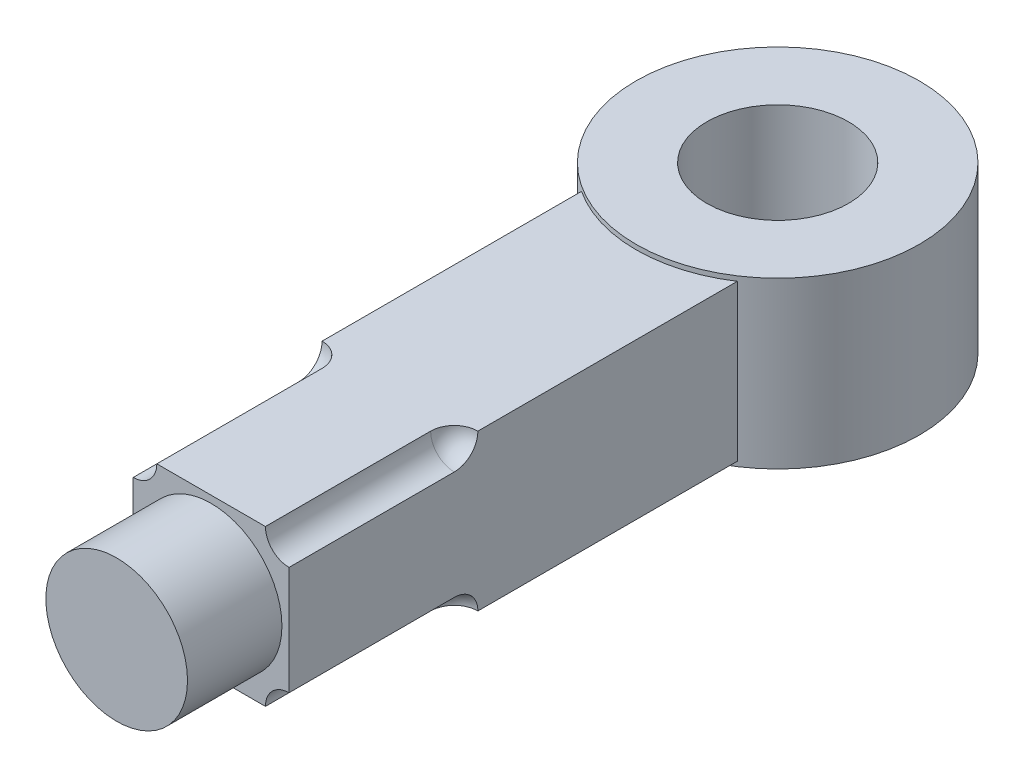
ISO-10303-21;
HEADER;
FILE_DESCRIPTION(('STEP AP214'),'2;1');
FILE_NAME('part.step','',(''),(''),'','','');
FILE_SCHEMA(('AUTOMOTIVE_DESIGN { 1 0 10303 214 1 1 1 1 }'));
ENDSEC;
DATA;
#1=APPLICATION_CONTEXT('core data for automotive mechanical design processes');
#2=APPLICATION_PROTOCOL_DEFINITION('international standard','automotive_design',2000,#1);
#3=PRODUCT_CONTEXT('',#1,'mechanical');
#4=PRODUCT('Part','Part','',(#3));
#5=PRODUCT_RELATED_PRODUCT_CATEGORY('part','',(#4));
#6=PRODUCT_DEFINITION_FORMATION('','',#4);
#7=PRODUCT_DEFINITION_CONTEXT('part definition',#1,'design');
#8=PRODUCT_DEFINITION('design','',#6,#7);
#9=PRODUCT_DEFINITION_SHAPE('','',#8);
#10=(LENGTH_UNIT() NAMED_UNIT(*) SI_UNIT(.MILLI.,.METRE.));
#11=(NAMED_UNIT(*) PLANE_ANGLE_UNIT() SI_UNIT($,.RADIAN.));
#12=(NAMED_UNIT(*) SI_UNIT($,.STERADIAN.) SOLID_ANGLE_UNIT());
#13=UNCERTAINTY_MEASURE_WITH_UNIT(LENGTH_MEASURE(1.E-05),#10,'distance_accuracy_value','');
#14=(GEOMETRIC_REPRESENTATION_CONTEXT(3) GLOBAL_UNCERTAINTY_ASSIGNED_CONTEXT((#13)) GLOBAL_UNIT_ASSIGNED_CONTEXT((#10,
#11,#12)) REPRESENTATION_CONTEXT('',''));
#15=CARTESIAN_POINT('',(0.,0.,0.));
#16=DIRECTION('',(0.,0.,1.));
#17=DIRECTION('',(1.,0.,0.));
#18=AXIS2_PLACEMENT_3D('',#15,#16,#17);
#19=CARTESIAN_POINT('',(-16.5,16.5,120.));
#20=DIRECTION('',(1.,0.,0.));
#21=DIRECTION('',(0.,1.,0.));
#22=AXIS2_PLACEMENT_3D('',#19,#20,#21);
#23=PLANE('',#22);
#24=DIRECTION('',(0.,0.,1.));
#25=VECTOR('',#24,1.);
#26=CARTESIAN_POINT('',(-16.5,11.4999999999999,80.));
#27=LINE('',#26,#25);
#28=CARTESIAN_POINT('',(-16.5,11.4999999999999,85.));
#29=VERTEX_POINT('',#28);
#30=CARTESIAN_POINT('',(-16.5,11.4999999999999,120.));
#31=VERTEX_POINT('',#30);
#32=EDGE_CURVE('E134',#29,#31,#27,.T.);
#33=ORIENTED_EDGE('',*,*,#32,.F.);
#34=CARTESIAN_POINT('',(-16.5,16.4999999999999,85.));
#35=DIRECTION('',(1.,0.,0.));
#36=DIRECTION('',(0.,1.,0.));
#37=AXIS2_PLACEMENT_3D('',#34,#35,#36);
#38=CIRCLE('',#37,5.);
#39=CARTESIAN_POINT('',(-16.5000000000001,16.4999999999999,80.));
#40=VERTEX_POINT('',#39);
#41=EDGE_CURVE('E121',#29,#40,#38,.T.);
#42=ORIENTED_EDGE('',*,*,#41,.T.);
#43=DIRECTION('',(0.,0.,-1.));
#44=VECTOR('',#43,1.);
#45=CARTESIAN_POINT('',(-16.5,16.5,120.));
#46=LINE('',#45,#44);
#47=CARTESIAN_POINT('',(-16.5,16.5,25.0549396327351));
#48=VERTEX_POINT('',#47);
#49=EDGE_CURVE('E126',#40,#48,#46,.T.);
#50=ORIENTED_EDGE('',*,*,#49,.T.);
#51=DIRECTION('',(0.,-1.,0.));
#52=VECTOR('',#51,1.);
#53=CARTESIAN_POINT('',(-16.5,17.5,25.0549396327351));
#54=LINE('',#53,#52);
#55=CARTESIAN_POINT('',(-16.5,-16.5,25.0549396327351));
#56=VERTEX_POINT('',#55);
#57=EDGE_CURVE('E205',#48,#56,#54,.T.);
#58=ORIENTED_EDGE('',*,*,#57,.T.);
#59=DIRECTION('',(0.,0.,-1.));
#60=VECTOR('',#59,1.);
#61=CARTESIAN_POINT('',(-16.5,-16.5,120.));
#62=LINE('',#61,#60);
#63=CARTESIAN_POINT('',(-16.5,-16.5,80.));
#64=VERTEX_POINT('',#63);
#65=EDGE_CURVE('E212',#64,#56,#62,.T.);
#66=ORIENTED_EDGE('',*,*,#65,.F.);
#67=CARTESIAN_POINT('',(-16.5,-16.5,85.));
#68=DIRECTION('',(1.,0.,0.));
#69=DIRECTION('',(0.,1.,0.));
#70=AXIS2_PLACEMENT_3D('',#67,#68,#69);
#71=CIRCLE('',#70,5.);
#72=CARTESIAN_POINT('',(-16.5,-11.5,85.));
#73=VERTEX_POINT('',#72);
#74=EDGE_CURVE('E160',#64,#73,#71,.T.);
#75=ORIENTED_EDGE('',*,*,#74,.T.);
#76=DIRECTION('',(0.,0.,1.));
#77=VECTOR('',#76,1.);
#78=CARTESIAN_POINT('',(-16.5,-11.5,80.));
#79=LINE('',#78,#77);
#80=CARTESIAN_POINT('',(-16.5,-11.5,120.));
#81=VERTEX_POINT('',#80);
#82=EDGE_CURVE('E251',#73,#81,#79,.T.);
#83=ORIENTED_EDGE('',*,*,#82,.T.);
#84=DIRECTION('',(0.,-1.,0.));
#85=VECTOR('',#84,1.);
#86=CARTESIAN_POINT('',(-16.5,16.5,120.));
#87=LINE('',#86,#85);
#88=EDGE_CURVE('E197',#31,#81,#87,.T.);
#89=ORIENTED_EDGE('',*,*,#88,.F.);
#90=EDGE_LOOP('',(#33,#42,#50,#58,#66,#75,#83,#89));
#91=FACE_BOUND('',#90,.T.);
#92=ADVANCED_FACE('F39',(#91),#23,.F.);
#93=CARTESIAN_POINT('',(16.5,16.5,120.));
#94=DIRECTION('',(-1.,0.,0.));
#95=DIRECTION('',(0.,0.,1.));
#96=AXIS2_PLACEMENT_3D('',#93,#94,#95);
#97=PLANE('',#96);
#98=DIRECTION('',(0.,0.,1.));
#99=VECTOR('',#98,1.);
#100=CARTESIAN_POINT('',(16.5000000000001,-11.4999999999998,80.));
#101=LINE('',#100,#99);
#102=CARTESIAN_POINT('',(16.5000000000001,-11.4999999999998,85.));
#103=VERTEX_POINT('',#102);
#104=CARTESIAN_POINT('',(16.5000000000001,-11.4999999999998,120.));
#105=VERTEX_POINT('',#104);
#106=EDGE_CURVE('E167',#103,#105,#101,.T.);
#107=ORIENTED_EDGE('',*,*,#106,.F.);
#108=CARTESIAN_POINT('',(16.5,-16.4999999999998,85.));
#109=DIRECTION('',(-1.,0.,0.));
#110=DIRECTION('',(0.,0.,1.));
#111=AXIS2_PLACEMENT_3D('',#108,#109,#110);
#112=CIRCLE('',#111,5.);
#113=CARTESIAN_POINT('',(16.5000000000002,-16.4999999999998,80.));
#114=VERTEX_POINT('',#113);
#115=EDGE_CURVE('E11',#103,#114,#112,.T.);
#116=ORIENTED_EDGE('',*,*,#115,.T.);
#117=DIRECTION('',(0.,0.,-1.));
#118=VECTOR('',#117,1.);
#119=CARTESIAN_POINT('',(16.5,-16.5,120.));
#120=LINE('',#119,#118);
#121=CARTESIAN_POINT('',(16.5,-16.5,25.0549396327351));
#122=VERTEX_POINT('',#121);
#123=EDGE_CURVE('E215',#114,#122,#120,.T.);
#124=ORIENTED_EDGE('',*,*,#123,.T.);
#125=DIRECTION('',(0.,-1.,0.));
#126=VECTOR('',#125,1.);
#127=CARTESIAN_POINT('',(16.5,17.5,25.0549396327351));
#128=LINE('',#127,#126);
#129=CARTESIAN_POINT('',(16.5,16.5,25.0549396327351));
#130=VERTEX_POINT('',#129);
#131=EDGE_CURVE('E224',#122,#130,#128,.F.);
#132=ORIENTED_EDGE('',*,*,#131,.T.);
#133=DIRECTION('',(0.,0.,-1.));
#134=VECTOR('',#133,1.);
#135=CARTESIAN_POINT('',(16.5,16.5,120.));
#136=LINE('',#135,#134);
#137=CARTESIAN_POINT('',(16.5,16.5,80.));
#138=VERTEX_POINT('',#137);
#139=EDGE_CURVE('E144',#138,#130,#136,.T.);
#140=ORIENTED_EDGE('',*,*,#139,.F.);
#141=CARTESIAN_POINT('',(16.5,16.5,85.));
#142=DIRECTION('',(-1.,0.,0.));
#143=DIRECTION('',(0.,0.,1.));
#144=AXIS2_PLACEMENT_3D('',#141,#142,#143);
#145=CIRCLE('',#144,5.);
#146=CARTESIAN_POINT('',(16.5,11.5,85.));
#147=VERTEX_POINT('',#146);
#148=EDGE_CURVE('E235',#138,#147,#145,.T.);
#149=ORIENTED_EDGE('',*,*,#148,.T.);
#150=DIRECTION('',(0.,0.,1.));
#151=VECTOR('',#150,1.);
#152=CARTESIAN_POINT('',(16.5,11.5,80.));
#153=LINE('',#152,#151);
#154=CARTESIAN_POINT('',(16.5,11.5,120.));
#155=VERTEX_POINT('',#154);
#156=EDGE_CURVE('E183',#147,#155,#153,.T.);
#157=ORIENTED_EDGE('',*,*,#156,.T.);
#158=DIRECTION('',(0.,1.,0.));
#159=VECTOR('',#158,1.);
#160=CARTESIAN_POINT('',(16.5,16.5,120.));
#161=LINE('',#160,#159);
#162=EDGE_CURVE('E175',#105,#155,#161,.T.);
#163=ORIENTED_EDGE('',*,*,#162,.F.);
#164=EDGE_LOOP('',(#107,#116,#124,#132,#140,#149,#157,#163));
#165=FACE_BOUND('',#164,.T.);
#166=ADVANCED_FACE('F174',(#165),#97,.F.);
#167=CARTESIAN_POINT('',(16.5,-16.5,120.));
#168=DIRECTION('',(0.,1.,0.));
#169=DIRECTION('',(-1.,0.,0.));
#170=AXIS2_PLACEMENT_3D('',#167,#168,#169);
#171=PLANE('',#170);
#172=DIRECTION('',(0.,0.,1.));
#173=VECTOR('',#172,1.);
#174=CARTESIAN_POINT('',(-11.5,-16.5,80.));
#175=LINE('',#174,#173);
#176=CARTESIAN_POINT('',(-11.5,-16.5,85.));
#177=VERTEX_POINT('',#176);
#178=CARTESIAN_POINT('',(-11.5,-16.5,120.));
#179=VERTEX_POINT('',#178);
#180=EDGE_CURVE('E258',#177,#179,#175,.T.);
#181=ORIENTED_EDGE('',*,*,#180,.F.);
#182=CARTESIAN_POINT('',(-16.5,-16.5,85.));
#183=DIRECTION('',(0.,1.,0.));
#184=DIRECTION('',(-1.,0.,0.));
#185=AXIS2_PLACEMENT_3D('',#182,#183,#184);
#186=CIRCLE('',#185,5.);
#187=EDGE_CURVE('E157',#177,#64,#186,.T.);
#188=ORIENTED_EDGE('',*,*,#187,.T.);
#189=ORIENTED_EDGE('',*,*,#65,.T.);
#190=CARTESIAN_POINT('',(0.,-16.5,0.));
#191=DIRECTION('',(0.,1.,0.));
#192=DIRECTION('',(-1.,0.,0.));
#193=AXIS2_PLACEMENT_3D('',#190,#191,#192);
#194=CIRCLE('',#193,30.);
#195=EDGE_CURVE('E229',#56,#122,#194,.T.);
#196=ORIENTED_EDGE('',*,*,#195,.T.);
#197=ORIENTED_EDGE('',*,*,#123,.F.);
#198=CARTESIAN_POINT('',(16.5000000000002,-16.5,85.));
#199=DIRECTION('',(0.,1.,0.));
#200=DIRECTION('',(-1.,0.,0.));
#201=AXIS2_PLACEMENT_3D('',#198,#199,#200);
#202=CIRCLE('',#201,5.);
#203=CARTESIAN_POINT('',(11.5000000000002,-16.4999999999999,85.));
#204=VERTEX_POINT('',#203);
#205=EDGE_CURVE('E50',#114,#204,#202,.T.);
#206=ORIENTED_EDGE('',*,*,#205,.T.);
#207=DIRECTION('',(0.,0.,1.));
#208=VECTOR('',#207,1.);
#209=CARTESIAN_POINT('',(11.5000000000002,-16.4999999999999,80.));
#210=LINE('',#209,#208);
#211=CARTESIAN_POINT('',(11.5000000000002,-16.4999999999999,120.));
#212=VERTEX_POINT('',#211);
#213=EDGE_CURVE('E169',#204,#212,#210,.T.);
#214=ORIENTED_EDGE('',*,*,#213,.T.);
#215=DIRECTION('',(1.,0.,0.));
#216=VECTOR('',#215,1.);
#217=CARTESIAN_POINT('',(16.5,-16.5,120.));
#218=LINE('',#217,#216);
#219=EDGE_CURVE('E202',#179,#212,#218,.T.);
#220=ORIENTED_EDGE('',*,*,#219,.F.);
#221=EDGE_LOOP('',(#181,#188,#189,#196,#197,#206,#214,#220));
#222=FACE_BOUND('',#221,.T.);
#223=ADVANCED_FACE('F268',(#222),#171,.F.);
#224=CARTESIAN_POINT('',(0.,0.,120.));
#225=DIRECTION('',(0.,0.,-1.));
#226=DIRECTION('',(-1.,0.,0.));
#227=AXIS2_PLACEMENT_3D('',#224,#225,#226);
#228=PLANE('',#227);
#229=CARTESIAN_POINT('',(0.,0.,120.));
#230=DIRECTION('',(0.,0.,1.));
#231=DIRECTION('',(1.,0.,0.));
#232=AXIS2_PLACEMENT_3D('',#229,#230,#231);
#233=CIRCLE('',#232,15.);
#234=CARTESIAN_POINT('',(15.,0.,120.));
#235=VERTEX_POINT('',#234);
#236=EDGE_CURVE('E196',#235,#235,#233,.T.);
#237=ORIENTED_EDGE('',*,*,#236,.F.);
#238=EDGE_LOOP('',(#237));
#239=FACE_BOUND('',#238,.T.);
#240=CARTESIAN_POINT('',(-16.5000000000001,16.4999999999999,120.));
#241=DIRECTION('',(0.,0.,1.));
#242=DIRECTION('',(0.,1.,0.));
#243=AXIS2_PLACEMENT_3D('',#240,#241,#242);
#244=CIRCLE('',#243,5.);
#245=CARTESIAN_POINT('',(-11.5000000000001,16.5,120.));
#246=VERTEX_POINT('',#245);
#247=EDGE_CURVE('E253',#31,#246,#244,.T.);
#248=ORIENTED_EDGE('',*,*,#247,.F.);
#249=ORIENTED_EDGE('',*,*,#88,.T.);
#250=CARTESIAN_POINT('',(-16.5,-16.5,120.));
#251=DIRECTION('',(0.,0.,1.));
#252=DIRECTION('',(-1.,0.,0.));
#253=AXIS2_PLACEMENT_3D('',#250,#251,#252);
#254=CIRCLE('',#253,5.);
#255=EDGE_CURVE('E177',#179,#81,#254,.T.);
#256=ORIENTED_EDGE('',*,*,#255,.F.);
#257=ORIENTED_EDGE('',*,*,#219,.T.);
#258=CARTESIAN_POINT('',(16.5000000000002,-16.4999999999998,120.));
#259=DIRECTION('',(0.,0.,1.));
#260=DIRECTION('',(0.,-1.,0.));
#261=AXIS2_PLACEMENT_3D('',#258,#259,#260);
#262=CIRCLE('',#261,5.);
#263=EDGE_CURVE('E173',#105,#212,#262,.T.);
#264=ORIENTED_EDGE('',*,*,#263,.F.);
#265=ORIENTED_EDGE('',*,*,#162,.T.);
#266=CARTESIAN_POINT('',(16.5,16.5,120.));
#267=DIRECTION('',(0.,0.,1.));
#268=DIRECTION('',(1.,0.,0.));
#269=AXIS2_PLACEMENT_3D('',#266,#267,#268);
#270=CIRCLE('',#269,5.);
#271=CARTESIAN_POINT('',(11.5,16.5,120.));
#272=VERTEX_POINT('',#271);
#273=EDGE_CURVE('E176',#272,#155,#270,.T.);
#274=ORIENTED_EDGE('',*,*,#273,.F.);
#275=DIRECTION('',(-1.,0.,0.));
#276=VECTOR('',#275,1.);
#277=CARTESIAN_POINT('',(16.5,16.5,120.));
#278=LINE('',#277,#276);
#279=EDGE_CURVE('E148',#272,#246,#278,.T.);
#280=ORIENTED_EDGE('',*,*,#279,.T.);
#281=EDGE_LOOP('',(#248,#249,#256,#257,#264,#265,#274,#280));
#282=FACE_BOUND('',#281,.T.);
#283=ADVANCED_FACE('F250',(#239,#282),#228,.F.);
#284=CARTESIAN_POINT('',(16.5,16.5,120.));
#285=DIRECTION('',(0.,-1.,0.));
#286=DIRECTION('',(1.,0.,0.));
#287=AXIS2_PLACEMENT_3D('',#284,#285,#286);
#288=PLANE('',#287);
#289=ORIENTED_EDGE('',*,*,#49,.F.);
#290=CARTESIAN_POINT('',(-16.5000000000001,16.5,85.));
#291=DIRECTION('',(0.,-1.,0.));
#292=DIRECTION('',(1.,0.,0.));
#293=AXIS2_PLACEMENT_3D('',#290,#291,#292);
#294=CIRCLE('',#293,5.);
#295=CARTESIAN_POINT('',(-11.5000000000001,16.5,85.));
#296=VERTEX_POINT('',#295);
#297=EDGE_CURVE('E140',#40,#296,#294,.T.);
#298=ORIENTED_EDGE('',*,*,#297,.T.);
#299=DIRECTION('',(0.,0.,1.));
#300=VECTOR('',#299,1.);
#301=CARTESIAN_POINT('',(-11.5000000000001,16.5,80.));
#302=LINE('',#301,#300);
#303=EDGE_CURVE('E184',#296,#246,#302,.T.);
#304=ORIENTED_EDGE('',*,*,#303,.T.);
#305=ORIENTED_EDGE('',*,*,#279,.F.);
#306=DIRECTION('',(0.,0.,1.));
#307=VECTOR('',#306,1.);
#308=CARTESIAN_POINT('',(11.5,16.5,80.));
#309=LINE('',#308,#307);
#310=CARTESIAN_POINT('',(11.5,16.5,85.));
#311=VERTEX_POINT('',#310);
#312=EDGE_CURVE('E181',#311,#272,#309,.T.);
#313=ORIENTED_EDGE('',*,*,#312,.F.);
#314=CARTESIAN_POINT('',(16.5,16.5,85.));
#315=DIRECTION('',(0.,-1.,0.));
#316=DIRECTION('',(1.,0.,0.));
#317=AXIS2_PLACEMENT_3D('',#314,#315,#316);
#318=CIRCLE('',#317,5.);
#319=EDGE_CURVE('E151',#311,#138,#318,.T.);
#320=ORIENTED_EDGE('',*,*,#319,.T.);
#321=ORIENTED_EDGE('',*,*,#139,.T.);
#322=CARTESIAN_POINT('',(0.,16.5,0.));
#323=DIRECTION('',(0.,-1.,0.));
#324=DIRECTION('',(1.,0.,0.));
#325=AXIS2_PLACEMENT_3D('',#322,#323,#324);
#326=CIRCLE('',#325,30.);
#327=EDGE_CURVE('E145',#130,#48,#326,.T.);
#328=ORIENTED_EDGE('',*,*,#327,.T.);
#329=EDGE_LOOP('',(#289,#298,#304,#305,#313,#320,#321,#328));
#330=FACE_BOUND('',#329,.T.);
#331=ADVANCED_FACE('F143',(#330),#288,.F.);
#332=CARTESIAN_POINT('',(0.,17.5,0.));
#333=DIRECTION('',(0.,-1.,0.));
#334=DIRECTION('',(0.,0.,-1.));
#335=AXIS2_PLACEMENT_3D('',#332,#333,#334);
#336=CYLINDRICAL_SURFACE('',#335,30.);
#337=CARTESIAN_POINT('',(0.,-17.5,0.));
#338=DIRECTION('',(0.,1.,0.));
#339=DIRECTION('',(0.,0.,1.));
#340=AXIS2_PLACEMENT_3D('',#337,#338,#339);
#341=CIRCLE('',#340,30.);
#342=CARTESIAN_POINT('',(0.,-17.5,30.));
#343=VERTEX_POINT('',#342);
#344=EDGE_CURVE('E216',#343,#343,#341,.T.);
#345=ORIENTED_EDGE('',*,*,#344,.T.);
#346=EDGE_LOOP('',(#345));
#347=FACE_BOUND('',#346,.T.);
#348=CARTESIAN_POINT('',(0.,17.5,0.));
#349=DIRECTION('',(0.,1.,0.));
#350=DIRECTION('',(0.,0.,1.));
#351=AXIS2_PLACEMENT_3D('',#348,#349,#350);
#352=CIRCLE('',#351,30.);
#353=CARTESIAN_POINT('',(0.,17.5,30.));
#354=VERTEX_POINT('',#353);
#355=EDGE_CURVE('E220',#354,#354,#352,.T.);
#356=ORIENTED_EDGE('',*,*,#355,.F.);
#357=EDGE_LOOP('',(#356));
#358=FACE_BOUND('',#357,.T.);
#359=ORIENTED_EDGE('',*,*,#57,.F.);
#360=ORIENTED_EDGE('',*,*,#327,.F.);
#361=ORIENTED_EDGE('',*,*,#131,.F.);
#362=ORIENTED_EDGE('',*,*,#195,.F.);
#363=EDGE_LOOP('',(#359,#360,#361,#362));
#364=FACE_BOUND('',#363,.T.);
#365=ADVANCED_FACE('F288',(#347,#358,#364),#336,.T.);
#366=CARTESIAN_POINT('',(0.,17.5,0.));
#367=DIRECTION('',(0.,1.,0.));
#368=DIRECTION('',(0.,0.,1.));
#369=AXIS2_PLACEMENT_3D('',#366,#367,#368);
#370=PLANE('',#369);
#371=CARTESIAN_POINT('',(0.,17.5,0.));
#372=DIRECTION('',(0.,1.,0.));
#373=DIRECTION('',(0.,0.,1.));
#374=AXIS2_PLACEMENT_3D('',#371,#372,#373);
#375=CIRCLE('',#374,15.);
#376=CARTESIAN_POINT('',(0.,17.5,15.));
#377=VERTEX_POINT('',#376);
#378=EDGE_CURVE('E186',#377,#377,#375,.T.);
#379=ORIENTED_EDGE('',*,*,#378,.F.);
#380=EDGE_LOOP('',(#379));
#381=FACE_BOUND('',#380,.T.);
#382=ORIENTED_EDGE('',*,*,#355,.T.);
#383=EDGE_LOOP('',(#382));
#384=FACE_BOUND('',#383,.T.);
#385=ADVANCED_FACE('F283',(#381,#384),#370,.T.);
#386=CARTESIAN_POINT('',(0.,-17.5,0.));
#387=DIRECTION('',(0.,1.,0.));
#388=DIRECTION('',(0.,0.,1.));
#389=AXIS2_PLACEMENT_3D('',#386,#387,#388);
#390=PLANE('',#389);
#391=CARTESIAN_POINT('',(0.,-17.5,0.));
#392=DIRECTION('',(0.,1.,0.));
#393=DIRECTION('',(0.,0.,1.));
#394=AXIS2_PLACEMENT_3D('',#391,#392,#393);
#395=CIRCLE('',#394,15.);
#396=CARTESIAN_POINT('',(0.,-17.5,15.));
#397=VERTEX_POINT('',#396);
#398=EDGE_CURVE('E192',#397,#397,#395,.T.);
#399=ORIENTED_EDGE('',*,*,#398,.T.);
#400=EDGE_LOOP('',(#399));
#401=FACE_BOUND('',#400,.T.);
#402=ORIENTED_EDGE('',*,*,#344,.F.);
#403=EDGE_LOOP('',(#402));
#404=FACE_BOUND('',#403,.T.);
#405=ADVANCED_FACE('F290',(#401,#404),#390,.F.);
#406=CARTESIAN_POINT('',(0.,0.,140.));
#407=DIRECTION('',(0.,0.,-1.));
#408=DIRECTION('',(-1.,0.,0.));
#409=AXIS2_PLACEMENT_3D('',#406,#407,#408);
#410=CYLINDRICAL_SURFACE('',#409,15.);
#411=CARTESIAN_POINT('',(0.,0.,140.));
#412=DIRECTION('',(0.,0.,1.));
#413=DIRECTION('',(1.,0.,0.));
#414=AXIS2_PLACEMENT_3D('',#411,#412,#413);
#415=CIRCLE('',#414,15.);
#416=CARTESIAN_POINT('',(15.,0.,140.));
#417=VERTEX_POINT('',#416);
#418=EDGE_CURVE('E194',#417,#417,#415,.T.);
#419=ORIENTED_EDGE('',*,*,#418,.F.);
#420=EDGE_LOOP('',(#419));
#421=FACE_BOUND('',#420,.T.);
#422=ORIENTED_EDGE('',*,*,#236,.T.);
#423=EDGE_LOOP('',(#422));
#424=FACE_BOUND('',#423,.T.);
#425=ADVANCED_FACE('F295',(#421,#424),#410,.T.);
#426=CARTESIAN_POINT('',(0.,0.,140.));
#427=DIRECTION('',(0.,0.,1.));
#428=DIRECTION('',(1.,0.,0.));
#429=AXIS2_PLACEMENT_3D('',#426,#427,#428);
#430=PLANE('',#429);
#431=ORIENTED_EDGE('',*,*,#418,.T.);
#432=EDGE_LOOP('',(#431));
#433=FACE_BOUND('',#432,.T.);
#434=ADVANCED_FACE('F397',(#433),#430,.T.);
#435=CARTESIAN_POINT('',(0.,17.5,0.));
#436=DIRECTION('',(0.,1.,0.));
#437=DIRECTION('',(0.,0.,1.));
#438=AXIS2_PLACEMENT_3D('',#435,#436,#437);
#439=CYLINDRICAL_SURFACE('',#438,15.);
#440=ORIENTED_EDGE('',*,*,#398,.F.);
#441=EDGE_LOOP('',(#440));
#442=FACE_BOUND('',#441,.T.);
#443=ORIENTED_EDGE('',*,*,#378,.T.);
#444=EDGE_LOOP('',(#443));
#445=FACE_BOUND('',#444,.T.);
#446=ADVANCED_FACE('F381',(#442,#445),#439,.F.);
#447=CARTESIAN_POINT('',(16.5,16.5,80.));
#448=DIRECTION('',(0.,0.,1.));
#449=DIRECTION('',(1.,0.,0.));
#450=AXIS2_PLACEMENT_3D('',#447,#448,#449);
#451=CYLINDRICAL_SURFACE('',#450,5.);
#452=ORIENTED_EDGE('',*,*,#156,.F.);
#453=CARTESIAN_POINT('',(16.5,16.5,85.));
#454=DIRECTION('',(0.,0.,1.));
#455=DIRECTION('',(1.,0.,0.));
#456=AXIS2_PLACEMENT_3D('',#453,#454,#455);
#457=CIRCLE('',#456,5.);
#458=EDGE_CURVE('E203',#147,#311,#457,.F.);
#459=ORIENTED_EDGE('',*,*,#458,.T.);
#460=ORIENTED_EDGE('',*,*,#312,.T.);
#461=ORIENTED_EDGE('',*,*,#273,.T.);
#462=EDGE_LOOP('',(#452,#459,#460,#461));
#463=FACE_BOUND('',#462,.T.);
#464=ADVANCED_FACE('F245',(#463),#451,.F.);
#465=CARTESIAN_POINT('',(16.5,16.5,85.));
#466=DIRECTION('',(0.,0.,1.));
#467=DIRECTION('',(1.,0.,0.));
#468=AXIS2_PLACEMENT_3D('',#465,#466,#467);
#469=SPHERICAL_SURFACE('',#468,5.);
#470=ORIENTED_EDGE('',*,*,#319,.F.);
#471=ORIENTED_EDGE('',*,*,#458,.F.);
#472=ORIENTED_EDGE('',*,*,#148,.F.);
#473=EDGE_LOOP('',(#470,#471,#472));
#474=FACE_BOUND('',#473,.T.);
#475=ADVANCED_FACE('F244',(#474),#469,.F.);
#476=CARTESIAN_POINT('',(16.5000000000002,-16.4999999999998,80.));
#477=DIRECTION('',(0.,0.,1.));
#478=DIRECTION('',(1.,0.,0.));
#479=AXIS2_PLACEMENT_3D('',#476,#477,#478);
#480=CYLINDRICAL_SURFACE('',#479,5.);
#481=ORIENTED_EDGE('',*,*,#213,.F.);
#482=CARTESIAN_POINT('',(16.5000000000002,-16.4999999999998,85.));
#483=DIRECTION('',(0.,0.,1.));
#484=DIRECTION('',(1.,0.,0.));
#485=AXIS2_PLACEMENT_3D('',#482,#483,#484);
#486=CIRCLE('',#485,5.);
#487=EDGE_CURVE('E161',#204,#103,#486,.F.);
#488=ORIENTED_EDGE('',*,*,#487,.T.);
#489=ORIENTED_EDGE('',*,*,#106,.T.);
#490=ORIENTED_EDGE('',*,*,#263,.T.);
#491=EDGE_LOOP('',(#481,#488,#489,#490));
#492=FACE_BOUND('',#491,.T.);
#493=ADVANCED_FACE('F163',(#492),#480,.F.);
#494=CARTESIAN_POINT('',(-16.5,-16.5,80.));
#495=DIRECTION('',(0.,0.,1.));
#496=DIRECTION('',(1.,0.,0.));
#497=AXIS2_PLACEMENT_3D('',#494,#495,#496);
#498=CYLINDRICAL_SURFACE('',#497,5.);
#499=ORIENTED_EDGE('',*,*,#82,.F.);
#500=CARTESIAN_POINT('',(-16.5,-16.5,85.));
#501=DIRECTION('',(0.,0.,1.));
#502=DIRECTION('',(1.,0.,0.));
#503=AXIS2_PLACEMENT_3D('',#500,#501,#502);
#504=CIRCLE('',#503,5.);
#505=EDGE_CURVE('E137',#73,#177,#504,.F.);
#506=ORIENTED_EDGE('',*,*,#505,.T.);
#507=ORIENTED_EDGE('',*,*,#180,.T.);
#508=ORIENTED_EDGE('',*,*,#255,.T.);
#509=EDGE_LOOP('',(#499,#506,#507,#508));
#510=FACE_BOUND('',#509,.T.);
#511=ADVANCED_FACE('F264',(#510),#498,.F.);
#512=CARTESIAN_POINT('',(-16.5000000000001,16.4999999999999,80.));
#513=DIRECTION('',(0.,0.,1.));
#514=DIRECTION('',(1.,0.,0.));
#515=AXIS2_PLACEMENT_3D('',#512,#513,#514);
#516=CYLINDRICAL_SURFACE('',#515,5.);
#517=ORIENTED_EDGE('',*,*,#303,.F.);
#518=CARTESIAN_POINT('',(-16.5000000000001,16.4999999999999,85.));
#519=DIRECTION('',(0.,0.,1.));
#520=DIRECTION('',(1.,0.,0.));
#521=AXIS2_PLACEMENT_3D('',#518,#519,#520);
#522=CIRCLE('',#521,5.);
#523=EDGE_CURVE('E149',#296,#29,#522,.F.);
#524=ORIENTED_EDGE('',*,*,#523,.T.);
#525=ORIENTED_EDGE('',*,*,#32,.T.);
#526=ORIENTED_EDGE('',*,*,#247,.T.);
#527=EDGE_LOOP('',(#517,#524,#525,#526));
#528=FACE_BOUND('',#527,.T.);
#529=ADVANCED_FACE('F252',(#528),#516,.F.);
#530=CARTESIAN_POINT('',(-16.5000000000001,16.4999999999999,85.));
#531=DIRECTION('',(0.,0.,1.));
#532=DIRECTION('',(1.,0.,0.));
#533=AXIS2_PLACEMENT_3D('',#530,#531,#532);
#534=SPHERICAL_SURFACE('',#533,5.);
#535=ORIENTED_EDGE('',*,*,#41,.F.);
#536=ORIENTED_EDGE('',*,*,#523,.F.);
#537=ORIENTED_EDGE('',*,*,#297,.F.);
#538=EDGE_LOOP('',(#535,#536,#537));
#539=FACE_BOUND('',#538,.T.);
#540=ADVANCED_FACE('F146',(#539),#534,.F.);
#541=CARTESIAN_POINT('',(-16.5,-16.5,85.));
#542=DIRECTION('',(0.,0.,1.));
#543=DIRECTION('',(1.,0.,0.));
#544=AXIS2_PLACEMENT_3D('',#541,#542,#543);
#545=SPHERICAL_SURFACE('',#544,5.);
#546=ORIENTED_EDGE('',*,*,#187,.F.);
#547=ORIENTED_EDGE('',*,*,#505,.F.);
#548=ORIENTED_EDGE('',*,*,#74,.F.);
#549=EDGE_LOOP('',(#546,#547,#548));
#550=FACE_BOUND('',#549,.T.);
#551=ADVANCED_FACE('F298',(#550),#545,.F.);
#552=CARTESIAN_POINT('',(16.5000000000002,-16.4999999999998,85.));
#553=DIRECTION('',(0.,0.,1.));
#554=DIRECTION('',(1.,0.,0.));
#555=AXIS2_PLACEMENT_3D('',#552,#553,#554);
#556=SPHERICAL_SURFACE('',#555,5.);
#557=ORIENTED_EDGE('',*,*,#115,.F.);
#558=ORIENTED_EDGE('',*,*,#487,.F.);
#559=ORIENTED_EDGE('',*,*,#205,.F.);
#560=EDGE_LOOP('',(#557,#558,#559));
#561=FACE_BOUND('',#560,.T.);
#562=ADVANCED_FACE('F41',(#561),#556,.F.);
#563=CLOSED_SHELL('',(#92,#166,#223,#283,#331,#365,#385,#405,#425,#434,#446,#464,#475,#493,#511,
#529,#540,#551,#562));
#564=MANIFOLD_SOLID_BREP('B2',#563);
#565=ADVANCED_BREP_SHAPE_REPRESENTATION('',(#18,#564),#14);
#566=SHAPE_DEFINITION_REPRESENTATION(#9,#565);
ENDSEC;
END-ISO-10303-21;
